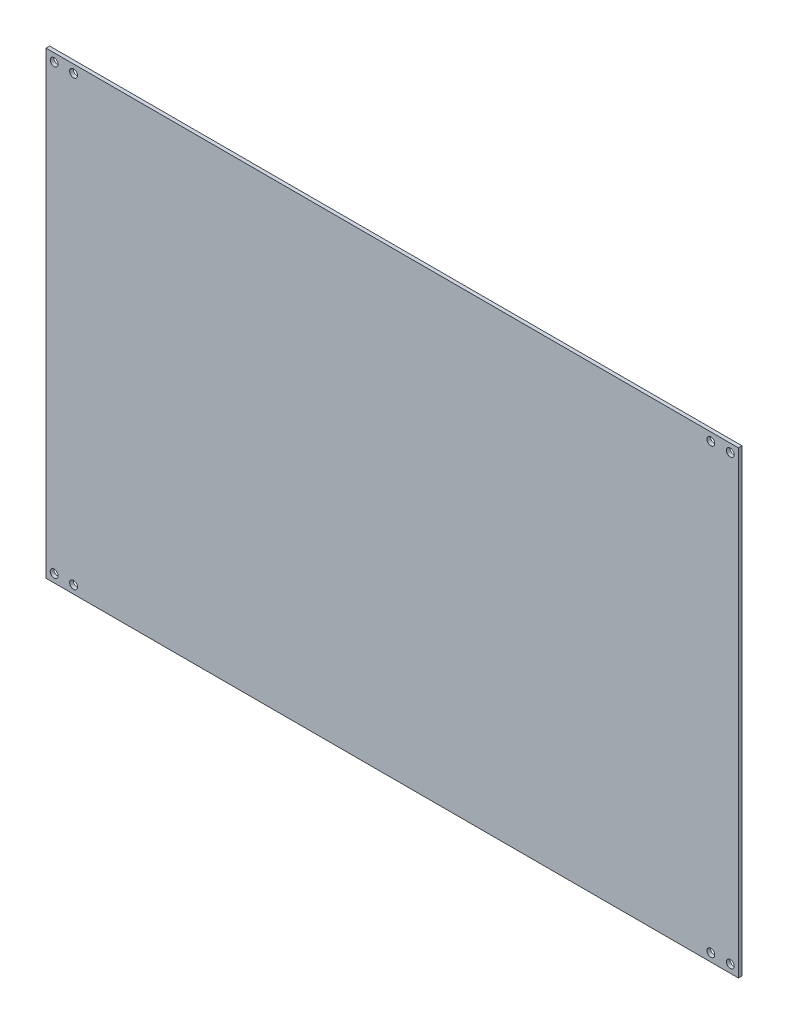
ISO-10303-21;
HEADER;
FILE_DESCRIPTION(('STEP AP214'),'2;1');
FILE_NAME('part.step','',(''),(''),'','','');
FILE_SCHEMA(('AUTOMOTIVE_DESIGN { 1 0 10303 214 1 1 1 1 }'));
ENDSEC;
DATA;
#1=APPLICATION_CONTEXT('core data for automotive mechanical design processes');
#2=APPLICATION_PROTOCOL_DEFINITION('international standard','automotive_design',2000,#1);
#3=PRODUCT_CONTEXT('',#1,'mechanical');
#4=PRODUCT('Part','Part','',(#3));
#5=PRODUCT_RELATED_PRODUCT_CATEGORY('part','',(#4));
#6=PRODUCT_DEFINITION_FORMATION('','',#4);
#7=PRODUCT_DEFINITION_CONTEXT('part definition',#1,'design');
#8=PRODUCT_DEFINITION('design','',#6,#7);
#9=PRODUCT_DEFINITION_SHAPE('','',#8);
#10=(LENGTH_UNIT() NAMED_UNIT(*) SI_UNIT(.MILLI.,.METRE.));
#11=(NAMED_UNIT(*) PLANE_ANGLE_UNIT() SI_UNIT($,.RADIAN.));
#12=(NAMED_UNIT(*) SI_UNIT($,.STERADIAN.) SOLID_ANGLE_UNIT());
#13=UNCERTAINTY_MEASURE_WITH_UNIT(LENGTH_MEASURE(1.E-05),#10,'distance_accuracy_value','');
#14=(GEOMETRIC_REPRESENTATION_CONTEXT(3) GLOBAL_UNCERTAINTY_ASSIGNED_CONTEXT((#13)) GLOBAL_UNIT_ASSIGNED_CONTEXT((#10,
#11,#12)) REPRESENTATION_CONTEXT('',''));
#15=CARTESIAN_POINT('',(0.,0.,0.));
#16=DIRECTION('',(0.,0.,1.));
#17=DIRECTION('',(1.,0.,0.));
#18=AXIS2_PLACEMENT_3D('',#15,#16,#17);
#19=CARTESIAN_POINT('',(-133.6,88.6,0.7));
#20=DIRECTION('',(1.,0.,0.));
#21=DIRECTION('',(0.,0.,-1.));
#22=AXIS2_PLACEMENT_3D('',#19,#20,#21);
#23=PLANE('',#22);
#24=DIRECTION('',(0.,-1.,0.));
#25=VECTOR('',#24,1.);
#26=CARTESIAN_POINT('',(-133.6,88.6,-0.7));
#27=LINE('',#26,#25);
#28=CARTESIAN_POINT('',(-133.6,88.6,-0.7));
#29=VERTEX_POINT('',#28);
#30=CARTESIAN_POINT('',(-133.6,-88.6,-0.7));
#31=VERTEX_POINT('',#30);
#32=EDGE_CURVE('E99',#29,#31,#27,.T.);
#33=ORIENTED_EDGE('',*,*,#32,.T.);
#34=DIRECTION('',(0.,0.,-1.));
#35=VECTOR('',#34,1.);
#36=CARTESIAN_POINT('',(-133.6,-88.6,0.7));
#37=LINE('',#36,#35);
#38=CARTESIAN_POINT('',(-133.6,-88.6,0.7));
#39=VERTEX_POINT('',#38);
#40=EDGE_CURVE('E11',#39,#31,#37,.T.);
#41=ORIENTED_EDGE('',*,*,#40,.F.);
#42=DIRECTION('',(0.,-1.,0.));
#43=VECTOR('',#42,1.);
#44=CARTESIAN_POINT('',(-133.6,88.6,0.7));
#45=LINE('',#44,#43);
#46=CARTESIAN_POINT('',(-133.6,88.6,0.7));
#47=VERTEX_POINT('',#46);
#48=EDGE_CURVE('E86',#47,#39,#45,.T.);
#49=ORIENTED_EDGE('',*,*,#48,.F.);
#50=DIRECTION('',(0.,0.,-1.));
#51=VECTOR('',#50,1.);
#52=CARTESIAN_POINT('',(-133.6,88.6,0.7));
#53=LINE('',#52,#51);
#54=EDGE_CURVE('E95',#47,#29,#53,.T.);
#55=ORIENTED_EDGE('',*,*,#54,.T.);
#56=EDGE_LOOP('',(#33,#41,#49,#55));
#57=FACE_BOUND('',#56,.T.);
#58=ADVANCED_FACE('F33',(#57),#23,.F.);
#59=CARTESIAN_POINT('',(-133.6,-88.6,0.7));
#60=DIRECTION('',(0.,1.,0.));
#61=DIRECTION('',(0.,0.,1.));
#62=AXIS2_PLACEMENT_3D('',#59,#60,#61);
#63=PLANE('',#62);
#64=DIRECTION('',(1.,0.,0.));
#65=VECTOR('',#64,1.);
#66=CARTESIAN_POINT('',(-133.6,-88.6,-0.7));
#67=LINE('',#66,#65);
#68=CARTESIAN_POINT('',(133.6,-88.6,-0.7));
#69=VERTEX_POINT('',#68);
#70=EDGE_CURVE('E90',#31,#69,#67,.T.);
#71=ORIENTED_EDGE('',*,*,#70,.T.);
#72=DIRECTION('',(0.,0.,-1.));
#73=VECTOR('',#72,1.);
#74=CARTESIAN_POINT('',(133.6,-88.6,0.7));
#75=LINE('',#74,#73);
#76=CARTESIAN_POINT('',(133.6,-88.6,0.7));
#77=VERTEX_POINT('',#76);
#78=EDGE_CURVE('E42',#77,#69,#75,.T.);
#79=ORIENTED_EDGE('',*,*,#78,.F.);
#80=DIRECTION('',(1.,0.,0.));
#81=VECTOR('',#80,1.);
#82=CARTESIAN_POINT('',(-133.6,-88.6,0.7));
#83=LINE('',#82,#81);
#84=EDGE_CURVE('E81',#39,#77,#83,.T.);
#85=ORIENTED_EDGE('',*,*,#84,.F.);
#86=ORIENTED_EDGE('',*,*,#40,.T.);
#87=EDGE_LOOP('',(#71,#79,#85,#86));
#88=FACE_BOUND('',#87,.T.);
#89=ADVANCED_FACE('F89',(#88),#63,.F.);
#90=CARTESIAN_POINT('',(133.6,88.6,0.7));
#91=DIRECTION('',(-1.,0.,0.));
#92=DIRECTION('',(0.,0.,1.));
#93=AXIS2_PLACEMENT_3D('',#90,#91,#92);
#94=PLANE('',#93);
#95=DIRECTION('',(0.,1.,0.));
#96=VECTOR('',#95,1.);
#97=CARTESIAN_POINT('',(133.6,88.6,-0.7));
#98=LINE('',#97,#96);
#99=CARTESIAN_POINT('',(133.6,88.6,-0.7));
#100=VERTEX_POINT('',#99);
#101=EDGE_CURVE('E68',#69,#100,#98,.T.);
#102=ORIENTED_EDGE('',*,*,#101,.T.);
#103=DIRECTION('',(0.,0.,-1.));
#104=VECTOR('',#103,1.);
#105=CARTESIAN_POINT('',(133.6,88.6,0.7));
#106=LINE('',#105,#104);
#107=CARTESIAN_POINT('',(133.6,88.6,0.7));
#108=VERTEX_POINT('',#107);
#109=EDGE_CURVE('E91',#108,#100,#106,.T.);
#110=ORIENTED_EDGE('',*,*,#109,.F.);
#111=DIRECTION('',(0.,1.,0.));
#112=VECTOR('',#111,1.);
#113=CARTESIAN_POINT('',(133.6,88.6,0.7));
#114=LINE('',#113,#112);
#115=EDGE_CURVE('E84',#77,#108,#114,.T.);
#116=ORIENTED_EDGE('',*,*,#115,.F.);
#117=ORIENTED_EDGE('',*,*,#78,.T.);
#118=EDGE_LOOP('',(#102,#110,#116,#117));
#119=FACE_BOUND('',#118,.T.);
#120=ADVANCED_FACE('F93',(#119),#94,.F.);
#121=CARTESIAN_POINT('',(-133.6,88.6,0.7));
#122=DIRECTION('',(0.,-1.,0.));
#123=DIRECTION('',(0.,0.,-1.));
#124=AXIS2_PLACEMENT_3D('',#121,#122,#123);
#125=PLANE('',#124);
#126=DIRECTION('',(-1.,0.,0.));
#127=VECTOR('',#126,1.);
#128=CARTESIAN_POINT('',(-133.6,88.6,-0.7));
#129=LINE('',#128,#127);
#130=EDGE_CURVE('E74',#100,#29,#129,.T.);
#131=ORIENTED_EDGE('',*,*,#130,.T.);
#132=ORIENTED_EDGE('',*,*,#54,.F.);
#133=DIRECTION('',(-1.,0.,0.));
#134=VECTOR('',#133,1.);
#135=CARTESIAN_POINT('',(-133.6,88.6,0.7));
#136=LINE('',#135,#134);
#137=EDGE_CURVE('E51',#108,#47,#136,.T.);
#138=ORIENTED_EDGE('',*,*,#137,.F.);
#139=ORIENTED_EDGE('',*,*,#109,.T.);
#140=EDGE_LOOP('',(#131,#132,#138,#139));
#141=FACE_BOUND('',#140,.T.);
#142=ADVANCED_FACE('F162',(#141),#125,.F.);
#143=CARTESIAN_POINT('',(0.,0.,0.7));
#144=DIRECTION('',(0.,0.,1.));
#145=DIRECTION('',(1.,0.,0.));
#146=AXIS2_PLACEMENT_3D('',#143,#144,#145);
#147=PLANE('',#146);
#148=CARTESIAN_POINT('',(122.975,85.475,0.699999999999999));
#149=DIRECTION('',(0.,0.,1.));
#150=DIRECTION('',(1.,0.,0.));
#151=AXIS2_PLACEMENT_3D('',#148,#149,#150);
#152=CIRCLE('',#151,1.5);
#153=CARTESIAN_POINT('',(124.475,85.475,0.699999999999999));
#154=VERTEX_POINT('',#153);
#155=EDGE_CURVE('E133',#154,#154,#152,.T.);
#156=ORIENTED_EDGE('',*,*,#155,.F.);
#157=EDGE_LOOP('',(#156));
#158=FACE_BOUND('',#157,.T.);
#159=CARTESIAN_POINT('',(130.475,85.475,0.699999999999999));
#160=DIRECTION('',(0.,0.,1.));
#161=DIRECTION('',(1.,0.,0.));
#162=AXIS2_PLACEMENT_3D('',#159,#160,#161);
#163=CIRCLE('',#162,1.5);
#164=CARTESIAN_POINT('',(131.975,85.475,0.699999999999999));
#165=VERTEX_POINT('',#164);
#166=EDGE_CURVE('E130',#165,#165,#163,.T.);
#167=ORIENTED_EDGE('',*,*,#166,.F.);
#168=EDGE_LOOP('',(#167));
#169=FACE_BOUND('',#168,.T.);
#170=CARTESIAN_POINT('',(122.975,-85.475,0.699999999999999));
#171=DIRECTION('',(0.,0.,1.));
#172=DIRECTION('',(1.,0.,0.));
#173=AXIS2_PLACEMENT_3D('',#170,#171,#172);
#174=CIRCLE('',#173,1.5);
#175=CARTESIAN_POINT('',(124.475,-85.475,0.699999999999999));
#176=VERTEX_POINT('',#175);
#177=EDGE_CURVE('E127',#176,#176,#174,.T.);
#178=ORIENTED_EDGE('',*,*,#177,.F.);
#179=EDGE_LOOP('',(#178));
#180=FACE_BOUND('',#179,.T.);
#181=CARTESIAN_POINT('',(130.475,-85.475,0.699999999999999));
#182=DIRECTION('',(0.,0.,1.));
#183=DIRECTION('',(1.,0.,0.));
#184=AXIS2_PLACEMENT_3D('',#181,#182,#183);
#185=CIRCLE('',#184,1.5);
#186=CARTESIAN_POINT('',(131.975,-85.475,0.699999999999999));
#187=VERTEX_POINT('',#186);
#188=EDGE_CURVE('E123',#187,#187,#185,.T.);
#189=ORIENTED_EDGE('',*,*,#188,.F.);
#190=EDGE_LOOP('',(#189));
#191=FACE_BOUND('',#190,.T.);
#192=CARTESIAN_POINT('',(-122.975,-85.475,0.699999999999999));
#193=DIRECTION('',(0.,0.,1.));
#194=DIRECTION('',(1.,0.,0.));
#195=AXIS2_PLACEMENT_3D('',#192,#193,#194);
#196=CIRCLE('',#195,1.5);
#197=CARTESIAN_POINT('',(-121.475,-85.475,0.699999999999999));
#198=VERTEX_POINT('',#197);
#199=EDGE_CURVE('E119',#198,#198,#196,.T.);
#200=ORIENTED_EDGE('',*,*,#199,.F.);
#201=EDGE_LOOP('',(#200));
#202=FACE_BOUND('',#201,.T.);
#203=CARTESIAN_POINT('',(-130.475,-85.475,0.699999999999999));
#204=DIRECTION('',(0.,0.,1.));
#205=DIRECTION('',(1.,0.,0.));
#206=AXIS2_PLACEMENT_3D('',#203,#204,#205);
#207=CIRCLE('',#206,1.5);
#208=CARTESIAN_POINT('',(-128.975,-85.475,0.699999999999999));
#209=VERTEX_POINT('',#208);
#210=EDGE_CURVE('E115',#209,#209,#207,.T.);
#211=ORIENTED_EDGE('',*,*,#210,.F.);
#212=EDGE_LOOP('',(#211));
#213=FACE_BOUND('',#212,.T.);
#214=CARTESIAN_POINT('',(-122.975,85.475,0.699999999999999));
#215=DIRECTION('',(0.,0.,1.));
#216=DIRECTION('',(1.,0.,0.));
#217=AXIS2_PLACEMENT_3D('',#214,#215,#216);
#218=CIRCLE('',#217,1.5);
#219=CARTESIAN_POINT('',(-121.475,85.475,0.699999999999999));
#220=VERTEX_POINT('',#219);
#221=EDGE_CURVE('E111',#220,#220,#218,.T.);
#222=ORIENTED_EDGE('',*,*,#221,.F.);
#223=EDGE_LOOP('',(#222));
#224=FACE_BOUND('',#223,.T.);
#225=CARTESIAN_POINT('',(-130.475,85.475,0.699999999999999));
#226=DIRECTION('',(0.,0.,1.));
#227=DIRECTION('',(1.,0.,0.));
#228=AXIS2_PLACEMENT_3D('',#225,#226,#227);
#229=CIRCLE('',#228,1.5);
#230=CARTESIAN_POINT('',(-128.975,85.475,0.699999999999999));
#231=VERTEX_POINT('',#230);
#232=EDGE_CURVE('E102',#231,#231,#229,.T.);
#233=ORIENTED_EDGE('',*,*,#232,.F.);
#234=EDGE_LOOP('',(#233));
#235=FACE_BOUND('',#234,.T.);
#236=ORIENTED_EDGE('',*,*,#48,.T.);
#237=ORIENTED_EDGE('',*,*,#84,.T.);
#238=ORIENTED_EDGE('',*,*,#115,.T.);
#239=ORIENTED_EDGE('',*,*,#137,.T.);
#240=EDGE_LOOP('',(#236,#237,#238,#239));
#241=FACE_BOUND('',#240,.T.);
#242=ADVANCED_FACE('F82',(#158,#169,#180,#191,#202,#213,#224,#235,#241),#147,.T.);
#243=CARTESIAN_POINT('',(0.,0.,-0.7));
#244=DIRECTION('',(0.,0.,1.));
#245=DIRECTION('',(1.,0.,0.));
#246=AXIS2_PLACEMENT_3D('',#243,#244,#245);
#247=PLANE('',#246);
#248=CARTESIAN_POINT('',(122.975,85.475,-0.699999999999999));
#249=DIRECTION('',(0.,0.,1.));
#250=DIRECTION('',(1.,0.,0.));
#251=AXIS2_PLACEMENT_3D('',#248,#249,#250);
#252=CIRCLE('',#251,1.5);
#253=CARTESIAN_POINT('',(124.475,85.475,-0.699999999999999));
#254=VERTEX_POINT('',#253);
#255=EDGE_CURVE('E36',#254,#254,#252,.T.);
#256=ORIENTED_EDGE('',*,*,#255,.T.);
#257=EDGE_LOOP('',(#256));
#258=FACE_BOUND('',#257,.T.);
#259=CARTESIAN_POINT('',(130.475,85.475,-0.699999999999999));
#260=DIRECTION('',(0.,0.,1.));
#261=DIRECTION('',(1.,0.,0.));
#262=AXIS2_PLACEMENT_3D('',#259,#260,#261);
#263=CIRCLE('',#262,1.5);
#264=CARTESIAN_POINT('',(131.975,85.475,-0.699999999999999));
#265=VERTEX_POINT('',#264);
#266=EDGE_CURVE('E131',#265,#265,#263,.T.);
#267=ORIENTED_EDGE('',*,*,#266,.T.);
#268=EDGE_LOOP('',(#267));
#269=FACE_BOUND('',#268,.T.);
#270=CARTESIAN_POINT('',(122.975,-85.475,-0.699999999999999));
#271=DIRECTION('',(0.,0.,1.));
#272=DIRECTION('',(1.,0.,0.));
#273=AXIS2_PLACEMENT_3D('',#270,#271,#272);
#274=CIRCLE('',#273,1.5);
#275=CARTESIAN_POINT('',(124.475,-85.475,-0.699999999999999));
#276=VERTEX_POINT('',#275);
#277=EDGE_CURVE('E128',#276,#276,#274,.T.);
#278=ORIENTED_EDGE('',*,*,#277,.T.);
#279=EDGE_LOOP('',(#278));
#280=FACE_BOUND('',#279,.T.);
#281=CARTESIAN_POINT('',(130.475,-85.475,-0.699999999999999));
#282=DIRECTION('',(0.,0.,1.));
#283=DIRECTION('',(1.,0.,0.));
#284=AXIS2_PLACEMENT_3D('',#281,#282,#283);
#285=CIRCLE('',#284,1.5);
#286=CARTESIAN_POINT('',(131.975,-85.475,-0.699999999999999));
#287=VERTEX_POINT('',#286);
#288=EDGE_CURVE('E124',#287,#287,#285,.T.);
#289=ORIENTED_EDGE('',*,*,#288,.T.);
#290=EDGE_LOOP('',(#289));
#291=FACE_BOUND('',#290,.T.);
#292=CARTESIAN_POINT('',(-122.975,-85.475,-0.699999999999999));
#293=DIRECTION('',(0.,0.,1.));
#294=DIRECTION('',(1.,0.,0.));
#295=AXIS2_PLACEMENT_3D('',#292,#293,#294);
#296=CIRCLE('',#295,1.5);
#297=CARTESIAN_POINT('',(-121.475,-85.475,-0.699999999999999));
#298=VERTEX_POINT('',#297);
#299=EDGE_CURVE('E120',#298,#298,#296,.T.);
#300=ORIENTED_EDGE('',*,*,#299,.T.);
#301=EDGE_LOOP('',(#300));
#302=FACE_BOUND('',#301,.T.);
#303=CARTESIAN_POINT('',(-130.475,-85.475,-0.699999999999999));
#304=DIRECTION('',(0.,0.,1.));
#305=DIRECTION('',(1.,0.,0.));
#306=AXIS2_PLACEMENT_3D('',#303,#304,#305);
#307=CIRCLE('',#306,1.5);
#308=CARTESIAN_POINT('',(-128.975,-85.475,-0.699999999999999));
#309=VERTEX_POINT('',#308);
#310=EDGE_CURVE('E116',#309,#309,#307,.T.);
#311=ORIENTED_EDGE('',*,*,#310,.T.);
#312=EDGE_LOOP('',(#311));
#313=FACE_BOUND('',#312,.T.);
#314=CARTESIAN_POINT('',(-122.975,85.475,-0.699999999999999));
#315=DIRECTION('',(0.,0.,1.));
#316=DIRECTION('',(1.,0.,0.));
#317=AXIS2_PLACEMENT_3D('',#314,#315,#316);
#318=CIRCLE('',#317,1.5);
#319=CARTESIAN_POINT('',(-121.475,85.475,-0.699999999999999));
#320=VERTEX_POINT('',#319);
#321=EDGE_CURVE('E112',#320,#320,#318,.T.);
#322=ORIENTED_EDGE('',*,*,#321,.T.);
#323=EDGE_LOOP('',(#322));
#324=FACE_BOUND('',#323,.T.);
#325=CARTESIAN_POINT('',(-130.475,85.475,-0.699999999999999));
#326=DIRECTION('',(0.,0.,1.));
#327=DIRECTION('',(1.,0.,0.));
#328=AXIS2_PLACEMENT_3D('',#325,#326,#327);
#329=CIRCLE('',#328,1.5);
#330=CARTESIAN_POINT('',(-128.975,85.475,-0.699999999999999));
#331=VERTEX_POINT('',#330);
#332=EDGE_CURVE('E108',#331,#331,#329,.T.);
#333=ORIENTED_EDGE('',*,*,#332,.T.);
#334=EDGE_LOOP('',(#333));
#335=FACE_BOUND('',#334,.T.);
#336=ORIENTED_EDGE('',*,*,#32,.F.);
#337=ORIENTED_EDGE('',*,*,#130,.F.);
#338=ORIENTED_EDGE('',*,*,#101,.F.);
#339=ORIENTED_EDGE('',*,*,#70,.F.);
#340=EDGE_LOOP('',(#336,#337,#338,#339));
#341=FACE_BOUND('',#340,.T.);
#342=ADVANCED_FACE('F161',(#258,#269,#280,#291,#302,#313,#324,#335,#341),#247,.F.);
#343=CARTESIAN_POINT('',(-130.475,85.475,-15.));
#344=DIRECTION('',(0.,0.,1.));
#345=DIRECTION('',(1.,0.,0.));
#346=AXIS2_PLACEMENT_3D('',#343,#344,#345);
#347=CYLINDRICAL_SURFACE('',#346,1.5);
#348=ORIENTED_EDGE('',*,*,#232,.T.);
#349=EDGE_LOOP('',(#348));
#350=FACE_BOUND('',#349,.T.);
#351=ORIENTED_EDGE('',*,*,#332,.F.);
#352=EDGE_LOOP('',(#351));
#353=FACE_BOUND('',#352,.T.);
#354=ADVANCED_FACE('F157',(#350,#353),#347,.F.);
#355=CARTESIAN_POINT('',(-122.975,85.475,-15.));
#356=DIRECTION('',(0.,0.,1.));
#357=DIRECTION('',(1.,0.,0.));
#358=AXIS2_PLACEMENT_3D('',#355,#356,#357);
#359=CYLINDRICAL_SURFACE('',#358,1.5);
#360=ORIENTED_EDGE('',*,*,#221,.T.);
#361=EDGE_LOOP('',(#360));
#362=FACE_BOUND('',#361,.T.);
#363=ORIENTED_EDGE('',*,*,#321,.F.);
#364=EDGE_LOOP('',(#363));
#365=FACE_BOUND('',#364,.T.);
#366=ADVANCED_FACE('F208',(#362,#365),#359,.F.);
#367=CARTESIAN_POINT('',(-130.475,-85.475,-15.));
#368=DIRECTION('',(0.,0.,1.));
#369=DIRECTION('',(1.,0.,0.));
#370=AXIS2_PLACEMENT_3D('',#367,#368,#369);
#371=CYLINDRICAL_SURFACE('',#370,1.5);
#372=ORIENTED_EDGE('',*,*,#210,.T.);
#373=EDGE_LOOP('',(#372));
#374=FACE_BOUND('',#373,.T.);
#375=ORIENTED_EDGE('',*,*,#310,.F.);
#376=EDGE_LOOP('',(#375));
#377=FACE_BOUND('',#376,.T.);
#378=ADVANCED_FACE('F213',(#374,#377),#371,.F.);
#379=CARTESIAN_POINT('',(-122.975,-85.475,-15.));
#380=DIRECTION('',(0.,0.,1.));
#381=DIRECTION('',(1.,0.,0.));
#382=AXIS2_PLACEMENT_3D('',#379,#380,#381);
#383=CYLINDRICAL_SURFACE('',#382,1.5);
#384=ORIENTED_EDGE('',*,*,#199,.T.);
#385=EDGE_LOOP('',(#384));
#386=FACE_BOUND('',#385,.T.);
#387=ORIENTED_EDGE('',*,*,#299,.F.);
#388=EDGE_LOOP('',(#387));
#389=FACE_BOUND('',#388,.T.);
#390=ADVANCED_FACE('F221',(#386,#389),#383,.F.);
#391=CARTESIAN_POINT('',(130.475,-85.475,-15.));
#392=DIRECTION('',(0.,0.,1.));
#393=DIRECTION('',(1.,0.,0.));
#394=AXIS2_PLACEMENT_3D('',#391,#392,#393);
#395=CYLINDRICAL_SURFACE('',#394,1.5);
#396=ORIENTED_EDGE('',*,*,#188,.T.);
#397=EDGE_LOOP('',(#396));
#398=FACE_BOUND('',#397,.T.);
#399=ORIENTED_EDGE('',*,*,#288,.F.);
#400=EDGE_LOOP('',(#399));
#401=FACE_BOUND('',#400,.T.);
#402=ADVANCED_FACE('F229',(#398,#401),#395,.F.);
#403=CARTESIAN_POINT('',(122.975,-85.475,-15.));
#404=DIRECTION('',(0.,0.,1.));
#405=DIRECTION('',(1.,0.,0.));
#406=AXIS2_PLACEMENT_3D('',#403,#404,#405);
#407=CYLINDRICAL_SURFACE('',#406,1.5);
#408=ORIENTED_EDGE('',*,*,#177,.T.);
#409=EDGE_LOOP('',(#408));
#410=FACE_BOUND('',#409,.T.);
#411=ORIENTED_EDGE('',*,*,#277,.F.);
#412=EDGE_LOOP('',(#411));
#413=FACE_BOUND('',#412,.T.);
#414=ADVANCED_FACE('F237',(#410,#413),#407,.F.);
#415=CARTESIAN_POINT('',(130.475,85.475,-15.));
#416=DIRECTION('',(0.,0.,1.));
#417=DIRECTION('',(1.,0.,0.));
#418=AXIS2_PLACEMENT_3D('',#415,#416,#417);
#419=CYLINDRICAL_SURFACE('',#418,1.5);
#420=ORIENTED_EDGE('',*,*,#166,.T.);
#421=EDGE_LOOP('',(#420));
#422=FACE_BOUND('',#421,.T.);
#423=ORIENTED_EDGE('',*,*,#266,.F.);
#424=EDGE_LOOP('',(#423));
#425=FACE_BOUND('',#424,.T.);
#426=ADVANCED_FACE('F245',(#422,#425),#419,.F.);
#427=CARTESIAN_POINT('',(122.975,85.475,-15.));
#428=DIRECTION('',(0.,0.,1.));
#429=DIRECTION('',(1.,0.,0.));
#430=AXIS2_PLACEMENT_3D('',#427,#428,#429);
#431=CYLINDRICAL_SURFACE('',#430,1.5);
#432=ORIENTED_EDGE('',*,*,#155,.T.);
#433=EDGE_LOOP('',(#432));
#434=FACE_BOUND('',#433,.T.);
#435=ORIENTED_EDGE('',*,*,#255,.F.);
#436=EDGE_LOOP('',(#435));
#437=FACE_BOUND('',#436,.T.);
#438=ADVANCED_FACE('F253',(#434,#437),#431,.F.);
#439=CLOSED_SHELL('',(#58,#89,#120,#142,#242,#342,#354,#366,#378,#390,#402,#414,#426,#438));
#440=MANIFOLD_SOLID_BREP('B2',#439);
#441=ADVANCED_BREP_SHAPE_REPRESENTATION('',(#18,#440),#14);
#442=SHAPE_DEFINITION_REPRESENTATION(#9,#441);
ENDSEC;
END-ISO-10303-21;
